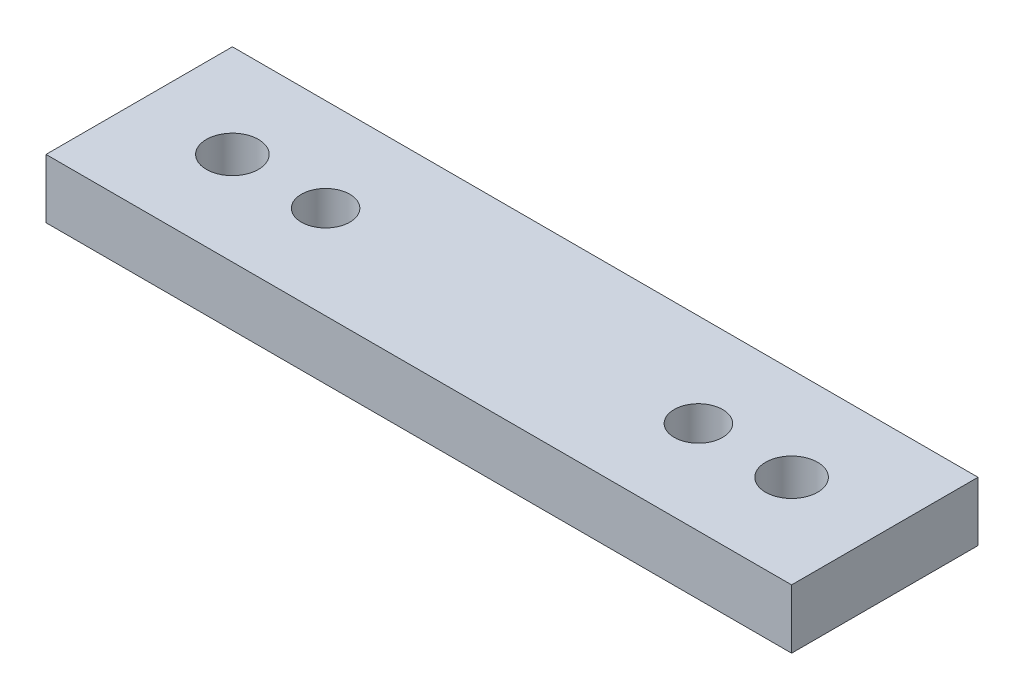
ISO-10303-21;
HEADER;
FILE_DESCRIPTION(('STEP AP214'),'2;1');
FILE_NAME('part.step','',(''),(''),'','','');
FILE_SCHEMA(('AUTOMOTIVE_DESIGN { 1 0 10303 214 1 1 1 1 }'));
ENDSEC;
DATA;
#1=APPLICATION_CONTEXT('core data for automotive mechanical design processes');
#2=APPLICATION_PROTOCOL_DEFINITION('international standard','automotive_design',2000,#1);
#3=PRODUCT_CONTEXT('',#1,'mechanical');
#4=PRODUCT('Part','Part','',(#3));
#5=PRODUCT_RELATED_PRODUCT_CATEGORY('part','',(#4));
#6=PRODUCT_DEFINITION_FORMATION('','',#4);
#7=PRODUCT_DEFINITION_CONTEXT('part definition',#1,'design');
#8=PRODUCT_DEFINITION('design','',#6,#7);
#9=PRODUCT_DEFINITION_SHAPE('','',#8);
#10=(LENGTH_UNIT() NAMED_UNIT(*) SI_UNIT(.MILLI.,.METRE.));
#11=(NAMED_UNIT(*) PLANE_ANGLE_UNIT() SI_UNIT($,.RADIAN.));
#12=(NAMED_UNIT(*) SI_UNIT($,.STERADIAN.) SOLID_ANGLE_UNIT());
#13=UNCERTAINTY_MEASURE_WITH_UNIT(LENGTH_MEASURE(1.E-05),#10,'distance_accuracy_value','');
#14=(GEOMETRIC_REPRESENTATION_CONTEXT(3) GLOBAL_UNCERTAINTY_ASSIGNED_CONTEXT((#13)) GLOBAL_UNIT_ASSIGNED_CONTEXT((#10,
#11,#12)) REPRESENTATION_CONTEXT('',''));
#15=CARTESIAN_POINT('',(0.,0.,0.));
#16=DIRECTION('',(0.,0.,1.));
#17=DIRECTION('',(1.,0.,0.));
#18=AXIS2_PLACEMENT_3D('',#15,#16,#17);
#19=CARTESIAN_POINT('',(40.,-3.175,-10.));
#20=DIRECTION('',(1.,0.,0.));
#21=DIRECTION('',(0.,0.,-1.));
#22=AXIS2_PLACEMENT_3D('',#19,#20,#21);
#23=PLANE('',#22);
#24=DIRECTION('',(0.,1.,0.));
#25=VECTOR('',#24,1.);
#26=CARTESIAN_POINT('',(40.,-3.175,-10.));
#27=LINE('',#26,#25);
#28=CARTESIAN_POINT('',(40.,-3.175,-10.));
#29=VERTEX_POINT('',#28);
#30=CARTESIAN_POINT('',(40.,3.175,-10.));
#31=VERTEX_POINT('',#30);
#32=EDGE_CURVE('E35',#29,#31,#27,.T.);
#33=ORIENTED_EDGE('',*,*,#32,.T.);
#34=DIRECTION('',(0.,0.,-1.));
#35=VECTOR('',#34,1.);
#36=CARTESIAN_POINT('',(40.,3.175,-10.));
#37=LINE('',#36,#35);
#38=CARTESIAN_POINT('',(40.,3.175,10.));
#39=VERTEX_POINT('',#38);
#40=EDGE_CURVE('E72',#39,#31,#37,.T.);
#41=ORIENTED_EDGE('',*,*,#40,.F.);
#42=DIRECTION('',(0.,1.,0.));
#43=VECTOR('',#42,1.);
#44=CARTESIAN_POINT('',(40.,-3.175,10.));
#45=LINE('',#44,#43);
#46=CARTESIAN_POINT('',(40.,-3.175,10.));
#47=VERTEX_POINT('',#46);
#48=EDGE_CURVE('E11',#47,#39,#45,.T.);
#49=ORIENTED_EDGE('',*,*,#48,.F.);
#50=DIRECTION('',(0.,0.,-1.));
#51=VECTOR('',#50,1.);
#52=CARTESIAN_POINT('',(40.,-3.175,-10.));
#53=LINE('',#52,#51);
#54=EDGE_CURVE('E73',#47,#29,#53,.T.);
#55=ORIENTED_EDGE('',*,*,#54,.T.);
#56=EDGE_LOOP('',(#33,#41,#49,#55));
#57=FACE_BOUND('',#56,.T.);
#58=ADVANCED_FACE('F32',(#57),#23,.T.);
#59=CARTESIAN_POINT('',(-40.,-3.175,10.));
#60=DIRECTION('',(0.,0.,1.));
#61=DIRECTION('',(1.,0.,0.));
#62=AXIS2_PLACEMENT_3D('',#59,#60,#61);
#63=PLANE('',#62);
#64=ORIENTED_EDGE('',*,*,#48,.T.);
#65=DIRECTION('',(1.,0.,0.));
#66=VECTOR('',#65,1.);
#67=CARTESIAN_POINT('',(-40.,3.175,10.));
#68=LINE('',#67,#66);
#69=CARTESIAN_POINT('',(-40.,3.175,10.));
#70=VERTEX_POINT('',#69);
#71=EDGE_CURVE('E90',#70,#39,#68,.T.);
#72=ORIENTED_EDGE('',*,*,#71,.F.);
#73=DIRECTION('',(0.,1.,0.));
#74=VECTOR('',#73,1.);
#75=CARTESIAN_POINT('',(-40.,-3.175,10.));
#76=LINE('',#75,#74);
#77=CARTESIAN_POINT('',(-40.,-3.175,10.));
#78=VERTEX_POINT('',#77);
#79=EDGE_CURVE('E40',#78,#70,#76,.T.);
#80=ORIENTED_EDGE('',*,*,#79,.F.);
#81=DIRECTION('',(1.,0.,0.));
#82=VECTOR('',#81,1.);
#83=CARTESIAN_POINT('',(-40.,-3.175,10.));
#84=LINE('',#83,#82);
#85=EDGE_CURVE('E78',#78,#47,#84,.T.);
#86=ORIENTED_EDGE('',*,*,#85,.T.);
#87=EDGE_LOOP('',(#64,#72,#80,#86));
#88=FACE_BOUND('',#87,.T.);
#89=ADVANCED_FACE('F122',(#88),#63,.T.);
#90=CARTESIAN_POINT('',(-40.,-3.175,-10.));
#91=DIRECTION('',(-1.,0.,0.));
#92=DIRECTION('',(0.,0.,1.));
#93=AXIS2_PLACEMENT_3D('',#90,#91,#92);
#94=PLANE('',#93);
#95=ORIENTED_EDGE('',*,*,#79,.T.);
#96=DIRECTION('',(0.,0.,1.));
#97=VECTOR('',#96,1.);
#98=CARTESIAN_POINT('',(-40.,3.175,-10.));
#99=LINE('',#98,#97);
#100=CARTESIAN_POINT('',(-40.,3.175,-10.));
#101=VERTEX_POINT('',#100);
#102=EDGE_CURVE('E85',#101,#70,#99,.T.);
#103=ORIENTED_EDGE('',*,*,#102,.F.);
#104=DIRECTION('',(0.,1.,0.));
#105=VECTOR('',#104,1.);
#106=CARTESIAN_POINT('',(-40.,-3.175,-10.));
#107=LINE('',#106,#105);
#108=CARTESIAN_POINT('',(-40.,-3.175,-10.));
#109=VERTEX_POINT('',#108);
#110=EDGE_CURVE('E77',#109,#101,#107,.T.);
#111=ORIENTED_EDGE('',*,*,#110,.F.);
#112=DIRECTION('',(0.,0.,1.));
#113=VECTOR('',#112,1.);
#114=CARTESIAN_POINT('',(-40.,-3.175,-10.));
#115=LINE('',#114,#113);
#116=EDGE_CURVE('E115',#109,#78,#115,.T.);
#117=ORIENTED_EDGE('',*,*,#116,.T.);
#118=EDGE_LOOP('',(#95,#103,#111,#117));
#119=FACE_BOUND('',#118,.T.);
#120=ADVANCED_FACE('F119',(#119),#94,.T.);
#121=CARTESIAN_POINT('',(-40.,-3.175,-10.));
#122=DIRECTION('',(0.,0.,-1.));
#123=DIRECTION('',(-1.,0.,0.));
#124=AXIS2_PLACEMENT_3D('',#121,#122,#123);
#125=PLANE('',#124);
#126=ORIENTED_EDGE('',*,*,#110,.T.);
#127=DIRECTION('',(-1.,0.,0.));
#128=VECTOR('',#127,1.);
#129=CARTESIAN_POINT('',(-40.,3.175,-10.));
#130=LINE('',#129,#128);
#131=EDGE_CURVE('E80',#31,#101,#130,.T.);
#132=ORIENTED_EDGE('',*,*,#131,.F.);
#133=ORIENTED_EDGE('',*,*,#32,.F.);
#134=DIRECTION('',(-1.,0.,0.));
#135=VECTOR('',#134,1.);
#136=CARTESIAN_POINT('',(-40.,-3.175,-10.));
#137=LINE('',#136,#135);
#138=EDGE_CURVE('E113',#29,#109,#137,.T.);
#139=ORIENTED_EDGE('',*,*,#138,.T.);
#140=EDGE_LOOP('',(#126,#132,#133,#139));
#141=FACE_BOUND('',#140,.T.);
#142=ADVANCED_FACE('F81',(#141),#125,.T.);
#143=CARTESIAN_POINT('',(0.,-3.175,0.));
#144=DIRECTION('',(0.,1.,0.));
#145=DIRECTION('',(0.,0.,1.));
#146=AXIS2_PLACEMENT_3D('',#143,#144,#145);
#147=PLANE('',#146);
#148=CARTESIAN_POINT('',(20.,-3.175,0.));
#149=DIRECTION('',(0.,1.,0.));
#150=DIRECTION('',(0.,0.,1.));
#151=AXIS2_PLACEMENT_3D('',#148,#149,#150);
#152=CIRCLE('',#151,2.6);
#153=CARTESIAN_POINT('',(20.,-3.175,2.6));
#154=VERTEX_POINT('',#153);
#155=EDGE_CURVE('E100',#154,#154,#152,.T.);
#156=ORIENTED_EDGE('',*,*,#155,.T.);
#157=EDGE_LOOP('',(#156));
#158=FACE_BOUND('',#157,.T.);
#159=CARTESIAN_POINT('',(-20.,-3.175,0.));
#160=DIRECTION('',(0.,1.,0.));
#161=DIRECTION('',(0.,0.,1.));
#162=AXIS2_PLACEMENT_3D('',#159,#160,#161);
#163=CIRCLE('',#162,2.6);
#164=CARTESIAN_POINT('',(-20.,-3.175,2.6));
#165=VERTEX_POINT('',#164);
#166=EDGE_CURVE('E103',#165,#165,#163,.T.);
#167=ORIENTED_EDGE('',*,*,#166,.T.);
#168=EDGE_LOOP('',(#167));
#169=FACE_BOUND('',#168,.T.);
#170=CARTESIAN_POINT('',(30.,-3.175,0.));
#171=DIRECTION('',(0.,1.,0.));
#172=DIRECTION('',(0.,0.,1.));
#173=AXIS2_PLACEMENT_3D('',#170,#171,#172);
#174=CIRCLE('',#173,2.794);
#175=CARTESIAN_POINT('',(30.,-3.175,2.794));
#176=VERTEX_POINT('',#175);
#177=EDGE_CURVE('E106',#176,#176,#174,.T.);
#178=ORIENTED_EDGE('',*,*,#177,.T.);
#179=EDGE_LOOP('',(#178));
#180=FACE_BOUND('',#179,.T.);
#181=CARTESIAN_POINT('',(-30.,-3.175,0.));
#182=DIRECTION('',(0.,1.,0.));
#183=DIRECTION('',(0.,0.,1.));
#184=AXIS2_PLACEMENT_3D('',#181,#182,#183);
#185=CIRCLE('',#184,2.794);
#186=CARTESIAN_POINT('',(-30.,-3.175,2.794));
#187=VERTEX_POINT('',#186);
#188=EDGE_CURVE('E109',#187,#187,#185,.T.);
#189=ORIENTED_EDGE('',*,*,#188,.T.);
#190=EDGE_LOOP('',(#189));
#191=FACE_BOUND('',#190,.T.);
#192=ORIENTED_EDGE('',*,*,#54,.F.);
#193=ORIENTED_EDGE('',*,*,#85,.F.);
#194=ORIENTED_EDGE('',*,*,#116,.F.);
#195=ORIENTED_EDGE('',*,*,#138,.F.);
#196=EDGE_LOOP('',(#192,#193,#194,#195));
#197=FACE_BOUND('',#196,.T.);
#198=ADVANCED_FACE('F124',(#158,#169,#180,#191,#197),#147,.F.);
#199=CARTESIAN_POINT('',(-30.,-3.175,0.));
#200=DIRECTION('',(0.,1.,0.));
#201=DIRECTION('',(0.,0.,1.));
#202=AXIS2_PLACEMENT_3D('',#199,#200,#201);
#203=CYLINDRICAL_SURFACE('',#202,2.794);
#204=ORIENTED_EDGE('',*,*,#188,.F.);
#205=EDGE_LOOP('',(#204));
#206=FACE_BOUND('',#205,.T.);
#207=CARTESIAN_POINT('',(-30.,3.175,0.));
#208=DIRECTION('',(0.,1.,0.));
#209=DIRECTION('',(0.,0.,1.));
#210=AXIS2_PLACEMENT_3D('',#207,#208,#209);
#211=CIRCLE('',#210,2.794);
#212=CARTESIAN_POINT('',(-30.,3.175,2.794));
#213=VERTEX_POINT('',#212);
#214=EDGE_CURVE('E91',#213,#213,#211,.T.);
#215=ORIENTED_EDGE('',*,*,#214,.T.);
#216=EDGE_LOOP('',(#215));
#217=FACE_BOUND('',#216,.T.);
#218=ADVANCED_FACE('F126',(#206,#217),#203,.F.);
#219=CARTESIAN_POINT('',(30.,-3.175,0.));
#220=DIRECTION('',(0.,1.,0.));
#221=DIRECTION('',(0.,0.,1.));
#222=AXIS2_PLACEMENT_3D('',#219,#220,#221);
#223=CYLINDRICAL_SURFACE('',#222,2.794);
#224=ORIENTED_EDGE('',*,*,#177,.F.);
#225=EDGE_LOOP('',(#224));
#226=FACE_BOUND('',#225,.T.);
#227=CARTESIAN_POINT('',(30.,3.175,0.));
#228=DIRECTION('',(0.,1.,0.));
#229=DIRECTION('',(0.,0.,1.));
#230=AXIS2_PLACEMENT_3D('',#227,#228,#229);
#231=CIRCLE('',#230,2.794);
#232=CARTESIAN_POINT('',(30.,3.175,2.794));
#233=VERTEX_POINT('',#232);
#234=EDGE_CURVE('E94',#233,#233,#231,.T.);
#235=ORIENTED_EDGE('',*,*,#234,.T.);
#236=EDGE_LOOP('',(#235));
#237=FACE_BOUND('',#236,.T.);
#238=ADVANCED_FACE('F133',(#226,#237),#223,.F.);
#239=CARTESIAN_POINT('',(-20.,-3.175,0.));
#240=DIRECTION('',(0.,1.,0.));
#241=DIRECTION('',(0.,0.,1.));
#242=AXIS2_PLACEMENT_3D('',#239,#240,#241);
#243=CYLINDRICAL_SURFACE('',#242,2.6);
#244=ORIENTED_EDGE('',*,*,#166,.F.);
#245=EDGE_LOOP('',(#244));
#246=FACE_BOUND('',#245,.T.);
#247=CARTESIAN_POINT('',(-20.,3.175,0.));
#248=DIRECTION('',(0.,1.,0.));
#249=DIRECTION('',(0.,0.,1.));
#250=AXIS2_PLACEMENT_3D('',#247,#248,#249);
#251=CIRCLE('',#250,2.6);
#252=CARTESIAN_POINT('',(-20.,3.175,2.6));
#253=VERTEX_POINT('',#252);
#254=EDGE_CURVE('E207',#253,#253,#251,.T.);
#255=ORIENTED_EDGE('',*,*,#254,.T.);
#256=EDGE_LOOP('',(#255));
#257=FACE_BOUND('',#256,.T.);
#258=ADVANCED_FACE('F171',(#246,#257),#243,.F.);
#259=CARTESIAN_POINT('',(20.,-3.175,0.));
#260=DIRECTION('',(0.,1.,0.));
#261=DIRECTION('',(0.,0.,1.));
#262=AXIS2_PLACEMENT_3D('',#259,#260,#261);
#263=CYLINDRICAL_SURFACE('',#262,2.6);
#264=ORIENTED_EDGE('',*,*,#155,.F.);
#265=EDGE_LOOP('',(#264));
#266=FACE_BOUND('',#265,.T.);
#267=CARTESIAN_POINT('',(20.,3.175,0.));
#268=DIRECTION('',(0.,1.,0.));
#269=DIRECTION('',(0.,0.,1.));
#270=AXIS2_PLACEMENT_3D('',#267,#268,#269);
#271=CIRCLE('',#270,2.6);
#272=CARTESIAN_POINT('',(20.,3.175,2.6));
#273=VERTEX_POINT('',#272);
#274=EDGE_CURVE('E211',#273,#273,#271,.T.);
#275=ORIENTED_EDGE('',*,*,#274,.T.);
#276=EDGE_LOOP('',(#275));
#277=FACE_BOUND('',#276,.T.);
#278=ADVANCED_FACE('F181',(#266,#277),#263,.F.);
#279=CARTESIAN_POINT('',(0.,3.175,0.));
#280=DIRECTION('',(0.,1.,0.));
#281=DIRECTION('',(0.,0.,1.));
#282=AXIS2_PLACEMENT_3D('',#279,#280,#281);
#283=PLANE('',#282);
#284=ORIENTED_EDGE('',*,*,#254,.F.);
#285=EDGE_LOOP('',(#284));
#286=FACE_BOUND('',#285,.T.);
#287=ORIENTED_EDGE('',*,*,#214,.F.);
#288=EDGE_LOOP('',(#287));
#289=FACE_BOUND('',#288,.T.);
#290=ORIENTED_EDGE('',*,*,#40,.T.);
#291=ORIENTED_EDGE('',*,*,#131,.T.);
#292=ORIENTED_EDGE('',*,*,#102,.T.);
#293=ORIENTED_EDGE('',*,*,#71,.T.);
#294=EDGE_LOOP('',(#290,#291,#292,#293));
#295=FACE_BOUND('',#294,.T.);
#296=ORIENTED_EDGE('',*,*,#234,.F.);
#297=EDGE_LOOP('',(#296));
#298=FACE_BOUND('',#297,.T.);
#299=ORIENTED_EDGE('',*,*,#274,.F.);
#300=EDGE_LOOP('',(#299));
#301=FACE_BOUND('',#300,.T.);
#302=ADVANCED_FACE('F88',(#286,#289,#295,#298,#301),#283,.T.);
#303=CLOSED_SHELL('',(#58,#89,#120,#142,#198,#218,#238,#258,#278,#302));
#304=MANIFOLD_SOLID_BREP('B2',#303);
#305=ADVANCED_BREP_SHAPE_REPRESENTATION('',(#18,#304),#14);
#306=SHAPE_DEFINITION_REPRESENTATION(#9,#305);
ENDSEC;
END-ISO-10303-21;
